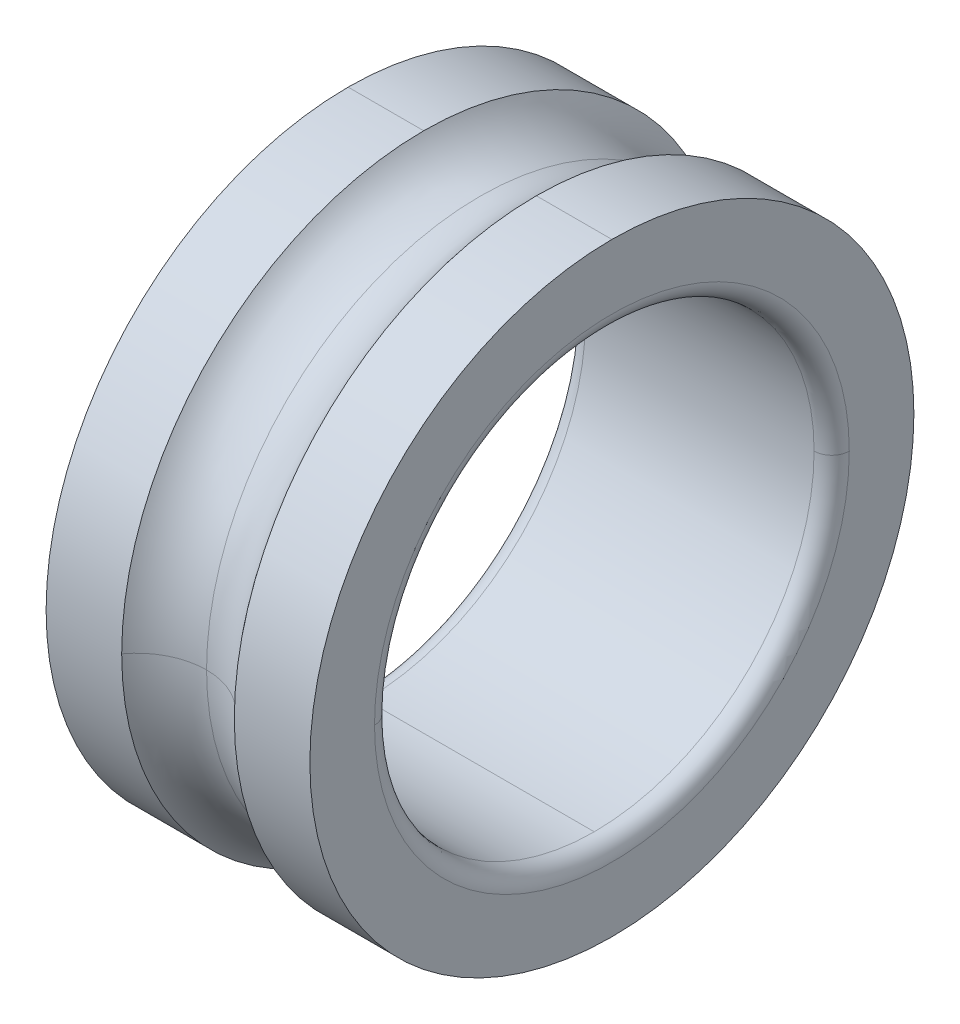
ISO-10303-21;
HEADER;
FILE_DESCRIPTION(('STEP AP214'),'2;1');
FILE_NAME('part.step','',(''),(''),'','','');
FILE_SCHEMA(('AUTOMOTIVE_DESIGN { 1 0 10303 214 1 1 1 1 }'));
ENDSEC;
DATA;
#1=APPLICATION_CONTEXT('core data for automotive mechanical design processes');
#2=APPLICATION_PROTOCOL_DEFINITION('international standard','automotive_design',2000,#1);
#3=PRODUCT_CONTEXT('',#1,'mechanical');
#4=PRODUCT('Part','Part','',(#3));
#5=PRODUCT_RELATED_PRODUCT_CATEGORY('part','',(#4));
#6=PRODUCT_DEFINITION_FORMATION('','',#4);
#7=PRODUCT_DEFINITION_CONTEXT('part definition',#1,'design');
#8=PRODUCT_DEFINITION('design','',#6,#7);
#9=PRODUCT_DEFINITION_SHAPE('','',#8);
#10=(LENGTH_UNIT() NAMED_UNIT(*) SI_UNIT(.MILLI.,.METRE.));
#11=(NAMED_UNIT(*) PLANE_ANGLE_UNIT() SI_UNIT($,.RADIAN.));
#12=(NAMED_UNIT(*) SI_UNIT($,.STERADIAN.) SOLID_ANGLE_UNIT());
#13=UNCERTAINTY_MEASURE_WITH_UNIT(LENGTH_MEASURE(1.E-05),#10,'distance_accuracy_value','');
#14=(GEOMETRIC_REPRESENTATION_CONTEXT(3) GLOBAL_UNCERTAINTY_ASSIGNED_CONTEXT((#13)) GLOBAL_UNIT_ASSIGNED_CONTEXT((#10,
#11,#12)) REPRESENTATION_CONTEXT('',''));
#15=CARTESIAN_POINT('',(0.,0.,0.));
#16=DIRECTION('',(0.,0.,1.));
#17=DIRECTION('',(1.,0.,0.));
#18=AXIS2_PLACEMENT_3D('',#15,#16,#17);
#19=CARTESIAN_POINT('',(12.8510883798217,0.,0.));
#20=DIRECTION('',(1.,0.,0.));
#21=DIRECTION('',(0.,1.,0.));
#22=AXIS2_PLACEMENT_3D('',#19,#20,#21);
#23=CYLINDRICAL_SURFACE('',#22,17.175);
#24=DIRECTION('',(1.,0.,0.));
#25=VECTOR('',#24,1.);
#26=CARTESIAN_POINT('',(12.8510883798217,17.175,0.));
#27=LINE('',#26,#25);
#28=CARTESIAN_POINT('',(10.7021767596434,17.175,0.));
#29=VERTEX_POINT('',#28);
#30=CARTESIAN_POINT('',(15.,17.175,0.));
#31=VERTEX_POINT('',#30);
#32=EDGE_CURVE('E154',#29,#31,#27,.T.);
#33=ORIENTED_EDGE('',*,*,#32,.T.);
#34=CARTESIAN_POINT('',(15.,0.,0.));
#35=DIRECTION('',(1.,0.,0.));
#36=DIRECTION('',(0.,1.,0.));
#37=AXIS2_PLACEMENT_3D('',#34,#35,#36);
#38=CIRCLE('',#37,17.175);
#39=CARTESIAN_POINT('',(15.,-17.175,0.));
#40=VERTEX_POINT('',#39);
#41=EDGE_CURVE('E162',#40,#31,#38,.T.);
#42=ORIENTED_EDGE('',*,*,#41,.F.);
#43=DIRECTION('',(-1.,0.,0.));
#44=VECTOR('',#43,1.);
#45=CARTESIAN_POINT('',(12.8510883798217,-17.175,0.));
#46=LINE('',#45,#44);
#47=CARTESIAN_POINT('',(10.7021767596434,-17.175,0.));
#48=VERTEX_POINT('',#47);
#49=EDGE_CURVE('E160',#40,#48,#46,.T.);
#50=ORIENTED_EDGE('',*,*,#49,.T.);
#51=CARTESIAN_POINT('',(10.7021767596434,0.,0.));
#52=DIRECTION('',(1.,0.,0.));
#53=DIRECTION('',(0.,1.,0.));
#54=AXIS2_PLACEMENT_3D('',#51,#52,#53);
#55=CIRCLE('',#54,17.175);
#56=CARTESIAN_POINT('',(10.7021767596434,0.,-17.175));
#57=VERTEX_POINT('',#56);
#58=EDGE_CURVE('E132',#48,#57,#55,.T.);
#59=ORIENTED_EDGE('',*,*,#58,.T.);
#60=CARTESIAN_POINT('',(10.7021767596434,0.,0.));
#61=DIRECTION('',(1.,0.,0.));
#62=DIRECTION('',(0.,1.,0.));
#63=AXIS2_PLACEMENT_3D('',#60,#61,#62);
#64=CIRCLE('',#63,17.175);
#65=EDGE_CURVE('E152',#57,#29,#64,.T.);
#66=ORIENTED_EDGE('',*,*,#65,.T.);
#67=EDGE_LOOP('',(#33,#42,#50,#59,#66));
#68=FACE_BOUND('',#67,.T.);
#69=ADVANCED_FACE('F16',(#68),#23,.T.);
#70=CARTESIAN_POINT('',(7.5,0.,0.));
#71=DIRECTION('',(1.,0.,0.));
#72=DIRECTION('',(0.,0.,-1.));
#73=AXIS2_PLACEMENT_3D('',#70,#71,#72);
#74=TOROIDAL_SURFACE('',#73,19.52,3.969);
#75=CARTESIAN_POINT('',(7.5,0.,0.));
#76=DIRECTION('',(-1.,0.,0.));
#77=DIRECTION('',(0.,0.,1.));
#78=AXIS2_PLACEMENT_3D('',#75,#76,#77);
#79=CIRCLE('',#78,15.551);
#80=CARTESIAN_POINT('',(7.5,0.,15.551));
#81=VERTEX_POINT('',#80);
#82=CARTESIAN_POINT('',(7.5,0.,-15.551));
#83=VERTEX_POINT('',#82);
#84=EDGE_CURVE('E114',#81,#83,#79,.T.);
#85=ORIENTED_EDGE('',*,*,#84,.T.);
#86=CARTESIAN_POINT('',(7.5,0.,-19.52));
#87=DIRECTION('',(0.,-1.,0.));
#88=DIRECTION('',(0.,0.,-1.));
#89=AXIS2_PLACEMENT_3D('',#86,#87,#88);
#90=CIRCLE('',#89,3.969);
#91=CARTESIAN_POINT('',(4.29782324035664,0.,-17.175));
#92=VERTEX_POINT('',#91);
#93=EDGE_CURVE('E128',#83,#92,#90,.T.);
#94=ORIENTED_EDGE('',*,*,#93,.T.);
#95=CARTESIAN_POINT('',(4.29782324035664,0.,0.));
#96=DIRECTION('',(1.,0.,0.));
#97=DIRECTION('',(0.,1.,0.));
#98=AXIS2_PLACEMENT_3D('',#95,#96,#97);
#99=CIRCLE('',#98,17.175);
#100=CARTESIAN_POINT('',(4.29782324035664,17.175,0.));
#101=VERTEX_POINT('',#100);
#102=EDGE_CURVE('E11',#92,#101,#99,.T.);
#103=ORIENTED_EDGE('',*,*,#102,.T.);
#104=CARTESIAN_POINT('',(4.29782324035664,0.,0.));
#105=DIRECTION('',(1.,0.,0.));
#106=DIRECTION('',(0.,1.,0.));
#107=AXIS2_PLACEMENT_3D('',#104,#105,#106);
#108=CIRCLE('',#107,17.175);
#109=CARTESIAN_POINT('',(4.29782324035664,0.,17.175));
#110=VERTEX_POINT('',#109);
#111=EDGE_CURVE('E116',#101,#110,#108,.T.);
#112=ORIENTED_EDGE('',*,*,#111,.T.);
#113=CARTESIAN_POINT('',(7.5,0.,19.52));
#114=DIRECTION('',(0.,-1.,0.));
#115=DIRECTION('',(0.,0.,1.));
#116=AXIS2_PLACEMENT_3D('',#113,#114,#115);
#117=CIRCLE('',#116,3.969);
#118=EDGE_CURVE('E109',#110,#81,#117,.T.);
#119=ORIENTED_EDGE('',*,*,#118,.T.);
#120=EDGE_LOOP('',(#85,#94,#103,#112,#119));
#121=FACE_BOUND('',#120,.T.);
#122=ADVANCED_FACE('F111',(#121),#74,.F.);
#123=CARTESIAN_POINT('',(2.14891162017832,0.,0.));
#124=DIRECTION('',(1.,0.,0.));
#125=DIRECTION('',(0.,1.,0.));
#126=AXIS2_PLACEMENT_3D('',#123,#124,#125);
#127=CYLINDRICAL_SURFACE('',#126,17.175);
#128=DIRECTION('',(1.,0.,0.));
#129=VECTOR('',#128,1.);
#130=CARTESIAN_POINT('',(2.14891162017832,17.175,0.));
#131=LINE('',#130,#129);
#132=CARTESIAN_POINT('',(0.,17.175,0.));
#133=VERTEX_POINT('',#132);
#134=EDGE_CURVE('E168',#133,#101,#131,.T.);
#135=ORIENTED_EDGE('',*,*,#134,.T.);
#136=ORIENTED_EDGE('',*,*,#102,.F.);
#137=CARTESIAN_POINT('',(4.29782324035664,0.,0.));
#138=DIRECTION('',(1.,0.,0.));
#139=DIRECTION('',(0.,1.,0.));
#140=AXIS2_PLACEMENT_3D('',#137,#138,#139);
#141=CIRCLE('',#140,17.175);
#142=CARTESIAN_POINT('',(4.29782324035664,-17.175,0.));
#143=VERTEX_POINT('',#142);
#144=EDGE_CURVE('E180',#143,#92,#141,.T.);
#145=ORIENTED_EDGE('',*,*,#144,.F.);
#146=DIRECTION('',(-1.,0.,0.));
#147=VECTOR('',#146,1.);
#148=CARTESIAN_POINT('',(2.14891162017832,-17.175,0.));
#149=LINE('',#148,#147);
#150=CARTESIAN_POINT('',(0.,-17.175,0.));
#151=VERTEX_POINT('',#150);
#152=EDGE_CURVE('E186',#143,#151,#149,.T.);
#153=ORIENTED_EDGE('',*,*,#152,.T.);
#154=CARTESIAN_POINT('',(0.,0.,0.));
#155=DIRECTION('',(1.,0.,0.));
#156=DIRECTION('',(0.,1.,0.));
#157=AXIS2_PLACEMENT_3D('',#154,#155,#156);
#158=CIRCLE('',#157,17.175);
#159=EDGE_CURVE('E23',#151,#133,#158,.T.);
#160=ORIENTED_EDGE('',*,*,#159,.T.);
#161=EDGE_LOOP('',(#135,#136,#145,#153,#160));
#162=FACE_BOUND('',#161,.T.);
#163=ADVANCED_FACE('F225',(#162),#127,.T.);
#164=CARTESIAN_POINT('',(0.,15.3375,0.));
#165=DIRECTION('',(-1.,0.,0.));
#166=DIRECTION('',(0.,0.,1.));
#167=AXIS2_PLACEMENT_3D('',#164,#165,#166);
#168=PLANE('',#167);
#169=CARTESIAN_POINT('',(0.,0.,0.));
#170=DIRECTION('',(1.,0.,0.));
#171=DIRECTION('',(0.,1.,0.));
#172=AXIS2_PLACEMENT_3D('',#169,#170,#171);
#173=CIRCLE('',#172,13.5);
#174=CARTESIAN_POINT('',(0.,0.,13.5));
#175=VERTEX_POINT('',#174);
#176=CARTESIAN_POINT('',(0.,0.,-13.5));
#177=VERTEX_POINT('',#176);
#178=EDGE_CURVE('E222',#175,#177,#173,.T.);
#179=ORIENTED_EDGE('',*,*,#178,.T.);
#180=CARTESIAN_POINT('',(0.,0.,0.));
#181=DIRECTION('',(1.,0.,0.));
#182=DIRECTION('',(0.,1.,0.));
#183=AXIS2_PLACEMENT_3D('',#180,#181,#182);
#184=CIRCLE('',#183,13.5);
#185=EDGE_CURVE('E202',#177,#175,#184,.T.);
#186=ORIENTED_EDGE('',*,*,#185,.T.);
#187=EDGE_LOOP('',(#179,#186));
#188=FACE_BOUND('',#187,.T.);
#189=CARTESIAN_POINT('',(0.,0.,0.));
#190=DIRECTION('',(1.,0.,0.));
#191=DIRECTION('',(0.,1.,0.));
#192=AXIS2_PLACEMENT_3D('',#189,#190,#191);
#193=CIRCLE('',#192,17.175);
#194=EDGE_CURVE('E171',#133,#151,#193,.T.);
#195=ORIENTED_EDGE('',*,*,#194,.F.);
#196=ORIENTED_EDGE('',*,*,#159,.F.);
#197=EDGE_LOOP('',(#195,#196));
#198=FACE_BOUND('',#197,.T.);
#199=ADVANCED_FACE('F229',(#188,#198),#168,.T.);
#200=CARTESIAN_POINT('',(1.,0.,0.));
#201=DIRECTION('',(1.,0.,0.));
#202=DIRECTION('',(0.,0.,-1.));
#203=AXIS2_PLACEMENT_3D('',#200,#201,#202);
#204=TOROIDAL_SURFACE('',#203,13.5,1.);
#205=CARTESIAN_POINT('',(1.,0.,-13.5));
#206=DIRECTION('',(0.,-1.,0.));
#207=DIRECTION('',(0.,0.,-1.));
#208=AXIS2_PLACEMENT_3D('',#205,#206,#207);
#209=CIRCLE('',#208,1.);
#210=CARTESIAN_POINT('',(1.,0.,-12.5));
#211=VERTEX_POINT('',#210);
#212=EDGE_CURVE('E190',#211,#177,#209,.T.);
#213=ORIENTED_EDGE('',*,*,#212,.T.);
#214=ORIENTED_EDGE('',*,*,#178,.F.);
#215=CARTESIAN_POINT('',(1.,0.,13.5));
#216=DIRECTION('',(0.,-1.,0.));
#217=DIRECTION('',(0.,0.,1.));
#218=AXIS2_PLACEMENT_3D('',#215,#216,#217);
#219=CIRCLE('',#218,1.);
#220=CARTESIAN_POINT('',(1.,0.,12.5));
#221=VERTEX_POINT('',#220);
#222=EDGE_CURVE('E199',#175,#221,#219,.T.);
#223=ORIENTED_EDGE('',*,*,#222,.T.);
#224=CARTESIAN_POINT('',(1.,0.,0.));
#225=DIRECTION('',(1.,0.,0.));
#226=DIRECTION('',(0.,1.,0.));
#227=AXIS2_PLACEMENT_3D('',#224,#225,#226);
#228=CIRCLE('',#227,12.5);
#229=CARTESIAN_POINT('',(1.,-12.5,0.));
#230=VERTEX_POINT('',#229);
#231=EDGE_CURVE('E158',#221,#230,#228,.T.);
#232=ORIENTED_EDGE('',*,*,#231,.T.);
#233=CARTESIAN_POINT('',(1.,0.,0.));
#234=DIRECTION('',(1.,0.,0.));
#235=DIRECTION('',(0.,1.,0.));
#236=AXIS2_PLACEMENT_3D('',#233,#234,#235);
#237=CIRCLE('',#236,12.5);
#238=EDGE_CURVE('E208',#230,#211,#237,.T.);
#239=ORIENTED_EDGE('',*,*,#238,.T.);
#240=EDGE_LOOP('',(#213,#214,#223,#232,#239));
#241=FACE_BOUND('',#240,.T.);
#242=ADVANCED_FACE('F274',(#241),#204,.T.);
#243=CARTESIAN_POINT('',(7.5,0.,0.));
#244=DIRECTION('',(1.,0.,0.));
#245=DIRECTION('',(0.,1.,0.));
#246=AXIS2_PLACEMENT_3D('',#243,#244,#245);
#247=CYLINDRICAL_SURFACE('',#246,12.5);
#248=DIRECTION('',(1.,0.,0.));
#249=VECTOR('',#248,1.);
#250=CARTESIAN_POINT('',(7.5,12.5,0.));
#251=LINE('',#250,#249);
#252=CARTESIAN_POINT('',(1.,12.5,0.));
#253=VERTEX_POINT('',#252);
#254=CARTESIAN_POINT('',(14.,12.5,0.));
#255=VERTEX_POINT('',#254);
#256=EDGE_CURVE('E205',#253,#255,#251,.T.);
#257=ORIENTED_EDGE('',*,*,#256,.T.);
#258=CARTESIAN_POINT('',(14.,0.,0.));
#259=DIRECTION('',(1.,0.,0.));
#260=DIRECTION('',(0.,1.,0.));
#261=AXIS2_PLACEMENT_3D('',#258,#259,#260);
#262=CIRCLE('',#261,12.5);
#263=CARTESIAN_POINT('',(14.,0.,12.5));
#264=VERTEX_POINT('',#263);
#265=EDGE_CURVE('E178',#255,#264,#262,.T.);
#266=ORIENTED_EDGE('',*,*,#265,.T.);
#267=CARTESIAN_POINT('',(14.,0.,0.));
#268=DIRECTION('',(1.,0.,0.));
#269=DIRECTION('',(0.,1.,0.));
#270=AXIS2_PLACEMENT_3D('',#267,#268,#269);
#271=CIRCLE('',#270,12.5);
#272=CARTESIAN_POINT('',(14.,-12.5,0.));
#273=VERTEX_POINT('',#272);
#274=EDGE_CURVE('E30',#264,#273,#271,.T.);
#275=ORIENTED_EDGE('',*,*,#274,.T.);
#276=DIRECTION('',(-1.,0.,0.));
#277=VECTOR('',#276,1.);
#278=CARTESIAN_POINT('',(7.5,-12.5,0.));
#279=LINE('',#278,#277);
#280=EDGE_CURVE('E210',#273,#230,#279,.T.);
#281=ORIENTED_EDGE('',*,*,#280,.T.);
#282=ORIENTED_EDGE('',*,*,#231,.F.);
#283=CARTESIAN_POINT('',(1.,0.,0.));
#284=DIRECTION('',(1.,0.,0.));
#285=DIRECTION('',(0.,1.,0.));
#286=AXIS2_PLACEMENT_3D('',#283,#284,#285);
#287=CIRCLE('',#286,12.5);
#288=EDGE_CURVE('E196',#253,#221,#287,.T.);
#289=ORIENTED_EDGE('',*,*,#288,.F.);
#290=EDGE_LOOP('',(#257,#266,#275,#281,#282,#289));
#291=FACE_BOUND('',#290,.T.);
#292=ADVANCED_FACE('F268',(#291),#247,.F.);
#293=CARTESIAN_POINT('',(14.,0.,0.));
#294=DIRECTION('',(1.,0.,0.));
#295=DIRECTION('',(0.,0.,-1.));
#296=AXIS2_PLACEMENT_3D('',#293,#294,#295);
#297=TOROIDAL_SURFACE('',#296,13.5,1.);
#298=CARTESIAN_POINT('',(14.,0.,-13.5));
#299=DIRECTION('',(0.,-1.,0.));
#300=DIRECTION('',(0.,0.,-1.));
#301=AXIS2_PLACEMENT_3D('',#298,#299,#300);
#302=CIRCLE('',#301,1.);
#303=CARTESIAN_POINT('',(15.,0.,-13.5));
#304=VERTEX_POINT('',#303);
#305=CARTESIAN_POINT('',(14.,0.,-12.5));
#306=VERTEX_POINT('',#305);
#307=EDGE_CURVE('E175',#304,#306,#302,.T.);
#308=ORIENTED_EDGE('',*,*,#307,.T.);
#309=CARTESIAN_POINT('',(14.,0.,0.));
#310=DIRECTION('',(1.,0.,0.));
#311=DIRECTION('',(0.,1.,0.));
#312=AXIS2_PLACEMENT_3D('',#309,#310,#311);
#313=CIRCLE('',#312,12.5);
#314=EDGE_CURVE('E213',#273,#306,#313,.T.);
#315=ORIENTED_EDGE('',*,*,#314,.F.);
#316=ORIENTED_EDGE('',*,*,#274,.F.);
#317=CARTESIAN_POINT('',(14.,0.,13.5));
#318=DIRECTION('',(0.,-1.,0.));
#319=DIRECTION('',(0.,0.,1.));
#320=AXIS2_PLACEMENT_3D('',#317,#318,#319);
#321=CIRCLE('',#320,1.);
#322=CARTESIAN_POINT('',(15.,0.,13.5));
#323=VERTEX_POINT('',#322);
#324=EDGE_CURVE('E174',#264,#323,#321,.T.);
#325=ORIENTED_EDGE('',*,*,#324,.T.);
#326=CARTESIAN_POINT('',(15.,0.,0.));
#327=DIRECTION('',(1.,0.,0.));
#328=DIRECTION('',(0.,1.,0.));
#329=AXIS2_PLACEMENT_3D('',#326,#327,#328);
#330=CIRCLE('',#329,13.5);
#331=EDGE_CURVE('E37',#323,#304,#330,.T.);
#332=ORIENTED_EDGE('',*,*,#331,.T.);
#333=EDGE_LOOP('',(#308,#315,#316,#325,#332));
#334=FACE_BOUND('',#333,.T.);
#335=ADVANCED_FACE('F260',(#334),#297,.T.);
#336=CARTESIAN_POINT('',(15.,15.3375,0.));
#337=DIRECTION('',(1.,0.,0.));
#338=DIRECTION('',(0.,1.,0.));
#339=AXIS2_PLACEMENT_3D('',#336,#337,#338);
#340=PLANE('',#339);
#341=CARTESIAN_POINT('',(15.,0.,0.));
#342=DIRECTION('',(1.,0.,0.));
#343=DIRECTION('',(0.,1.,0.));
#344=AXIS2_PLACEMENT_3D('',#341,#342,#343);
#345=CIRCLE('',#344,13.5);
#346=EDGE_CURVE('E172',#304,#323,#345,.T.);
#347=ORIENTED_EDGE('',*,*,#346,.F.);
#348=ORIENTED_EDGE('',*,*,#331,.F.);
#349=EDGE_LOOP('',(#347,#348));
#350=FACE_BOUND('',#349,.T.);
#351=CARTESIAN_POINT('',(15.,0.,0.));
#352=DIRECTION('',(1.,0.,0.));
#353=DIRECTION('',(0.,1.,0.));
#354=AXIS2_PLACEMENT_3D('',#351,#352,#353);
#355=CIRCLE('',#354,17.175);
#356=EDGE_CURVE('E121',#31,#40,#355,.T.);
#357=ORIENTED_EDGE('',*,*,#356,.T.);
#358=ORIENTED_EDGE('',*,*,#41,.T.);
#359=EDGE_LOOP('',(#357,#358));
#360=FACE_BOUND('',#359,.T.);
#361=ADVANCED_FACE('F257',(#350,#360),#340,.T.);
#362=CARTESIAN_POINT('',(14.,0.,0.));
#363=DIRECTION('',(1.,0.,0.));
#364=DIRECTION('',(0.,0.,-1.));
#365=AXIS2_PLACEMENT_3D('',#362,#363,#364);
#366=TOROIDAL_SURFACE('',#365,13.5,1.);
#367=ORIENTED_EDGE('',*,*,#307,.F.);
#368=ORIENTED_EDGE('',*,*,#346,.T.);
#369=ORIENTED_EDGE('',*,*,#324,.F.);
#370=ORIENTED_EDGE('',*,*,#265,.F.);
#371=CARTESIAN_POINT('',(14.,0.,0.));
#372=DIRECTION('',(1.,0.,0.));
#373=DIRECTION('',(0.,1.,0.));
#374=AXIS2_PLACEMENT_3D('',#371,#372,#373);
#375=CIRCLE('',#374,12.5);
#376=EDGE_CURVE('E216',#306,#255,#375,.T.);
#377=ORIENTED_EDGE('',*,*,#376,.F.);
#378=EDGE_LOOP('',(#367,#368,#369,#370,#377));
#379=FACE_BOUND('',#378,.T.);
#380=ADVANCED_FACE('F259',(#379),#366,.T.);
#381=CARTESIAN_POINT('',(7.5,0.,0.));
#382=DIRECTION('',(1.,0.,0.));
#383=DIRECTION('',(0.,1.,0.));
#384=AXIS2_PLACEMENT_3D('',#381,#382,#383);
#385=CYLINDRICAL_SURFACE('',#384,12.5);
#386=ORIENTED_EDGE('',*,*,#256,.F.);
#387=CARTESIAN_POINT('',(1.,0.,0.));
#388=DIRECTION('',(1.,0.,0.));
#389=DIRECTION('',(0.,1.,0.));
#390=AXIS2_PLACEMENT_3D('',#387,#388,#389);
#391=CIRCLE('',#390,12.5);
#392=EDGE_CURVE('E193',#211,#253,#391,.T.);
#393=ORIENTED_EDGE('',*,*,#392,.F.);
#394=ORIENTED_EDGE('',*,*,#238,.F.);
#395=ORIENTED_EDGE('',*,*,#280,.F.);
#396=ORIENTED_EDGE('',*,*,#314,.T.);
#397=ORIENTED_EDGE('',*,*,#376,.T.);
#398=EDGE_LOOP('',(#386,#393,#394,#395,#396,#397));
#399=FACE_BOUND('',#398,.T.);
#400=ADVANCED_FACE('F242',(#399),#385,.F.);
#401=CARTESIAN_POINT('',(1.,0.,0.));
#402=DIRECTION('',(1.,0.,0.));
#403=DIRECTION('',(0.,0.,-1.));
#404=AXIS2_PLACEMENT_3D('',#401,#402,#403);
#405=TOROIDAL_SURFACE('',#404,13.5,1.);
#406=ORIENTED_EDGE('',*,*,#212,.F.);
#407=ORIENTED_EDGE('',*,*,#392,.T.);
#408=ORIENTED_EDGE('',*,*,#288,.T.);
#409=ORIENTED_EDGE('',*,*,#222,.F.);
#410=ORIENTED_EDGE('',*,*,#185,.F.);
#411=EDGE_LOOP('',(#406,#407,#408,#409,#410));
#412=FACE_BOUND('',#411,.T.);
#413=ADVANCED_FACE('F233',(#412),#405,.T.);
#414=CARTESIAN_POINT('',(2.14891162017832,0.,0.));
#415=DIRECTION('',(1.,0.,0.));
#416=DIRECTION('',(0.,1.,0.));
#417=AXIS2_PLACEMENT_3D('',#414,#415,#416);
#418=CYLINDRICAL_SURFACE('',#417,17.175);
#419=ORIENTED_EDGE('',*,*,#134,.F.);
#420=ORIENTED_EDGE('',*,*,#194,.T.);
#421=ORIENTED_EDGE('',*,*,#152,.F.);
#422=CARTESIAN_POINT('',(4.29782324035664,0.,0.));
#423=DIRECTION('',(1.,0.,0.));
#424=DIRECTION('',(0.,1.,0.));
#425=AXIS2_PLACEMENT_3D('',#422,#423,#424);
#426=CIRCLE('',#425,17.175);
#427=EDGE_CURVE('E120',#110,#143,#426,.T.);
#428=ORIENTED_EDGE('',*,*,#427,.F.);
#429=ORIENTED_EDGE('',*,*,#111,.F.);
#430=EDGE_LOOP('',(#419,#420,#421,#428,#429));
#431=FACE_BOUND('',#430,.T.);
#432=ADVANCED_FACE('F231',(#431),#418,.T.);
#433=CARTESIAN_POINT('',(7.5,0.,0.));
#434=DIRECTION('',(1.,0.,0.));
#435=DIRECTION('',(0.,0.,-1.));
#436=AXIS2_PLACEMENT_3D('',#433,#434,#435);
#437=TOROIDAL_SURFACE('',#436,19.52,3.969);
#438=CARTESIAN_POINT('',(7.5,0.,0.));
#439=DIRECTION('',(-1.,0.,0.));
#440=DIRECTION('',(0.,0.,1.));
#441=AXIS2_PLACEMENT_3D('',#438,#439,#440);
#442=CIRCLE('',#441,15.551);
#443=EDGE_CURVE('E124',#83,#81,#442,.T.);
#444=ORIENTED_EDGE('',*,*,#443,.T.);
#445=ORIENTED_EDGE('',*,*,#118,.F.);
#446=ORIENTED_EDGE('',*,*,#427,.T.);
#447=ORIENTED_EDGE('',*,*,#144,.T.);
#448=ORIENTED_EDGE('',*,*,#93,.F.);
#449=EDGE_LOOP('',(#444,#445,#446,#447,#448));
#450=FACE_BOUND('',#449,.T.);
#451=ADVANCED_FACE('F126',(#450),#437,.F.);
#452=CARTESIAN_POINT('',(12.8510883798217,0.,0.));
#453=DIRECTION('',(1.,0.,0.));
#454=DIRECTION('',(0.,1.,0.));
#455=AXIS2_PLACEMENT_3D('',#452,#453,#454);
#456=CYLINDRICAL_SURFACE('',#455,17.175);
#457=ORIENTED_EDGE('',*,*,#32,.F.);
#458=CARTESIAN_POINT('',(10.7021767596434,0.,0.));
#459=DIRECTION('',(1.,0.,0.));
#460=DIRECTION('',(0.,1.,0.));
#461=AXIS2_PLACEMENT_3D('',#458,#459,#460);
#462=CIRCLE('',#461,17.175);
#463=CARTESIAN_POINT('',(10.7021767596434,0.,17.175));
#464=VERTEX_POINT('',#463);
#465=EDGE_CURVE('E144',#29,#464,#462,.T.);
#466=ORIENTED_EDGE('',*,*,#465,.T.);
#467=CARTESIAN_POINT('',(10.7021767596434,0.,0.));
#468=DIRECTION('',(1.,0.,0.));
#469=DIRECTION('',(0.,1.,0.));
#470=AXIS2_PLACEMENT_3D('',#467,#468,#469);
#471=CIRCLE('',#470,17.175);
#472=EDGE_CURVE('E140',#464,#48,#471,.T.);
#473=ORIENTED_EDGE('',*,*,#472,.T.);
#474=ORIENTED_EDGE('',*,*,#49,.F.);
#475=ORIENTED_EDGE('',*,*,#356,.F.);
#476=EDGE_LOOP('',(#457,#466,#473,#474,#475));
#477=FACE_BOUND('',#476,.T.);
#478=ADVANCED_FACE('F240',(#477),#456,.T.);
#479=CARTESIAN_POINT('',(7.5,0.,0.));
#480=DIRECTION('',(1.,0.,0.));
#481=DIRECTION('',(0.,0.,-1.));
#482=AXIS2_PLACEMENT_3D('',#479,#480,#481);
#483=TOROIDAL_SURFACE('',#482,19.52,3.969);
#484=ORIENTED_EDGE('',*,*,#443,.F.);
#485=CARTESIAN_POINT('',(7.5,0.,-19.52));
#486=DIRECTION('',(0.,-1.,0.));
#487=DIRECTION('',(0.,0.,-1.));
#488=AXIS2_PLACEMENT_3D('',#485,#486,#487);
#489=CIRCLE('',#488,3.969);
#490=EDGE_CURVE('E133',#57,#83,#489,.T.);
#491=ORIENTED_EDGE('',*,*,#490,.F.);
#492=ORIENTED_EDGE('',*,*,#58,.F.);
#493=ORIENTED_EDGE('',*,*,#472,.F.);
#494=CARTESIAN_POINT('',(7.5,0.,19.52));
#495=DIRECTION('',(0.,-1.,0.));
#496=DIRECTION('',(0.,0.,1.));
#497=AXIS2_PLACEMENT_3D('',#494,#495,#496);
#498=CIRCLE('',#497,3.969);
#499=EDGE_CURVE('E136',#81,#464,#498,.T.);
#500=ORIENTED_EDGE('',*,*,#499,.F.);
#501=EDGE_LOOP('',(#484,#491,#492,#493,#500));
#502=FACE_BOUND('',#501,.T.);
#503=ADVANCED_FACE('F137',(#502),#483,.F.);
#504=CARTESIAN_POINT('',(7.5,0.,0.));
#505=DIRECTION('',(1.,0.,0.));
#506=DIRECTION('',(0.,0.,-1.));
#507=AXIS2_PLACEMENT_3D('',#504,#505,#506);
#508=TOROIDAL_SURFACE('',#507,19.52,3.969);
#509=ORIENTED_EDGE('',*,*,#84,.F.);
#510=ORIENTED_EDGE('',*,*,#499,.T.);
#511=ORIENTED_EDGE('',*,*,#465,.F.);
#512=ORIENTED_EDGE('',*,*,#65,.F.);
#513=ORIENTED_EDGE('',*,*,#490,.T.);
#514=EDGE_LOOP('',(#509,#510,#511,#512,#513));
#515=FACE_BOUND('',#514,.T.);
#516=ADVANCED_FACE('F146',(#515),#508,.F.);
#517=CLOSED_SHELL('',(#69,#122,#163,#199,#242,#292,#335,#361,#380,#400,#413,#432,#451,#478,#503,#516));
#518=MANIFOLD_SOLID_BREP('B1',#517);
#519=ADVANCED_BREP_SHAPE_REPRESENTATION('',(#18,#518),#14);
#520=SHAPE_DEFINITION_REPRESENTATION(#9,#519);
ENDSEC;
END-ISO-10303-21;
